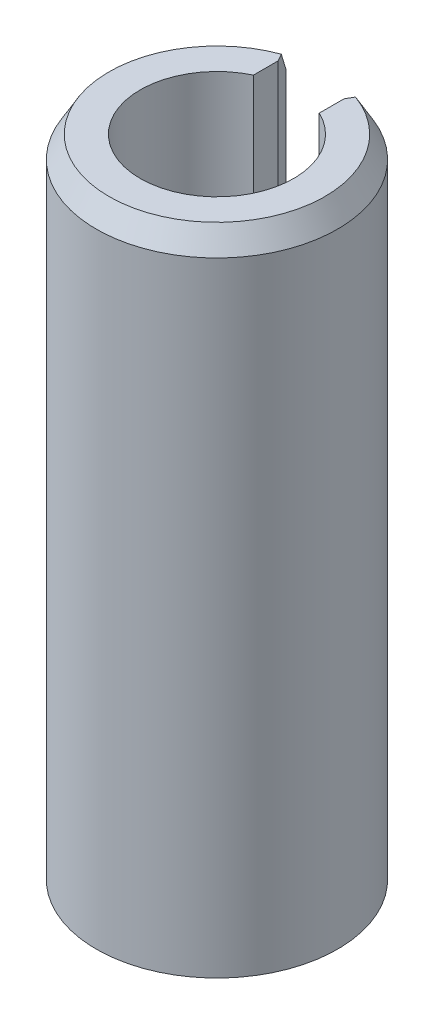
ISO-10303-21;
HEADER;
FILE_DESCRIPTION(('STEP AP214'),'2;1');
FILE_NAME('part.step','',(''),(''),'','','');
FILE_SCHEMA(('AUTOMOTIVE_DESIGN { 1 0 10303 214 1 1 1 1 }'));
ENDSEC;
DATA;
#1=APPLICATION_CONTEXT('core data for automotive mechanical design processes');
#2=APPLICATION_PROTOCOL_DEFINITION('international standard','automotive_design',2000,#1);
#3=PRODUCT_CONTEXT('',#1,'mechanical');
#4=PRODUCT('Part','Part','',(#3));
#5=PRODUCT_RELATED_PRODUCT_CATEGORY('part','',(#4));
#6=PRODUCT_DEFINITION_FORMATION('','',#4);
#7=PRODUCT_DEFINITION_CONTEXT('part definition',#1,'design');
#8=PRODUCT_DEFINITION('design','',#6,#7);
#9=PRODUCT_DEFINITION_SHAPE('','',#8);
#10=(LENGTH_UNIT() NAMED_UNIT(*) SI_UNIT(.MILLI.,.METRE.));
#11=(NAMED_UNIT(*) PLANE_ANGLE_UNIT() SI_UNIT($,.RADIAN.));
#12=(NAMED_UNIT(*) SI_UNIT($,.STERADIAN.) SOLID_ANGLE_UNIT());
#13=UNCERTAINTY_MEASURE_WITH_UNIT(LENGTH_MEASURE(1.E-05),#10,'distance_accuracy_value','');
#14=(GEOMETRIC_REPRESENTATION_CONTEXT(3) GLOBAL_UNCERTAINTY_ASSIGNED_CONTEXT((#13)) GLOBAL_UNIT_ASSIGNED_CONTEXT((#10,
#11,#12)) REPRESENTATION_CONTEXT('',''));
#15=CARTESIAN_POINT('',(0.,0.,0.));
#16=DIRECTION('',(0.,0.,1.));
#17=DIRECTION('',(1.,0.,0.));
#18=AXIS2_PLACEMENT_3D('',#15,#16,#17);
#19=CARTESIAN_POINT('',(0.,15.,0.));
#20=DIRECTION('',(0.,1.,0.));
#21=DIRECTION('',(0.,0.,1.));
#22=AXIS2_PLACEMENT_3D('',#19,#20,#21);
#23=PLANE('',#22);
#24=DIRECTION('',(0.499999999999997,0.,0.86602540378444));
#25=VECTOR('',#24,1.);
#26=CARTESIAN_POINT('',(0.366637572792843,15.,-0.211678301346978));
#27=LINE('',#26,#25);
#28=CARTESIAN_POINT('',(-0.75,15.,-2.14575131106459));
#29=VERTEX_POINT('',#28);
#30=CARTESIAN_POINT('',(-0.845683473796838,15.,-2.3114799491254));
#31=VERTEX_POINT('',#30);
#32=EDGE_CURVE('E140',#29,#31,#27,.F.);
#33=ORIENTED_EDGE('',*,*,#32,.T.);
#34=CARTESIAN_POINT('',(0.,15.,0.));
#35=DIRECTION('',(0.,1.,0.));
#36=DIRECTION('',(0.,0.,1.));
#37=AXIS2_PLACEMENT_3D('',#34,#35,#36);
#38=CIRCLE('',#37,2.46132486540518);
#39=CARTESIAN_POINT('',(0.845683473796839,15.,-2.3114799491254));
#40=VERTEX_POINT('',#39);
#41=EDGE_CURVE('E11',#31,#40,#38,.T.);
#42=ORIENTED_EDGE('',*,*,#41,.T.);
#43=DIRECTION('',(-0.499999999999998,0.,0.86602540378444));
#44=VECTOR('',#43,1.);
#45=CARTESIAN_POINT('',(-0.366637572792845,15.,-0.211678301346979));
#46=LINE('',#45,#44);
#47=CARTESIAN_POINT('',(0.75,15.,-2.14575131106459));
#48=VERTEX_POINT('',#47);
#49=EDGE_CURVE('E121',#40,#48,#46,.T.);
#50=ORIENTED_EDGE('',*,*,#49,.T.);
#51=DIRECTION('',(0.,0.,-1.));
#52=VECTOR('',#51,1.);
#53=CARTESIAN_POINT('',(0.749999999999999,15.,-3.13146030368442));
#54=LINE('',#53,#52);
#55=CARTESIAN_POINT('',(0.75,15.,-1.58113883008419));
#56=VERTEX_POINT('',#55);
#57=EDGE_CURVE('E106',#56,#48,#54,.T.);
#58=ORIENTED_EDGE('',*,*,#57,.F.);
#59=CARTESIAN_POINT('',(0.,15.,0.));
#60=DIRECTION('',(0.,1.,0.));
#61=DIRECTION('',(0.,0.,1.));
#62=AXIS2_PLACEMENT_3D('',#59,#60,#61);
#63=CIRCLE('',#62,1.75);
#64=CARTESIAN_POINT('',(-0.75,15.,-1.58113883008419));
#65=VERTEX_POINT('',#64);
#66=EDGE_CURVE('E115',#65,#56,#63,.T.);
#67=ORIENTED_EDGE('',*,*,#66,.F.);
#68=DIRECTION('',(0.,0.,1.));
#69=VECTOR('',#68,1.);
#70=CARTESIAN_POINT('',(-0.75,15.,-3.13146030368442));
#71=LINE('',#70,#69);
#72=EDGE_CURVE('E123',#29,#65,#71,.T.);
#73=ORIENTED_EDGE('',*,*,#72,.F.);
#74=EDGE_LOOP('',(#33,#42,#50,#58,#67,#73));
#75=FACE_BOUND('',#74,.T.);
#76=ADVANCED_FACE('F33',(#75),#23,.T.);
#77=CARTESIAN_POINT('',(0.,0.,0.));
#78=DIRECTION('',(0.,1.,0.));
#79=DIRECTION('',(0.,0.,1.));
#80=AXIS2_PLACEMENT_3D('',#77,#78,#79);
#81=PLANE('',#80);
#82=DIRECTION('',(0.,0.,-1.));
#83=VECTOR('',#82,1.);
#84=CARTESIAN_POINT('',(0.749999999999999,0.,-3.13146030368442));
#85=LINE('',#84,#83);
#86=CARTESIAN_POINT('',(0.75,0.,-1.58113883008419));
#87=VERTEX_POINT('',#86);
#88=CARTESIAN_POINT('',(0.75,0.,-2.12132034355964));
#89=VERTEX_POINT('',#88);
#90=EDGE_CURVE('E109',#87,#89,#85,.T.);
#91=ORIENTED_EDGE('',*,*,#90,.T.);
#92=CARTESIAN_POINT('',(0.,0.,0.));
#93=DIRECTION('',(0.,1.,0.));
#94=DIRECTION('',(0.,0.,1.));
#95=AXIS2_PLACEMENT_3D('',#92,#93,#94);
#96=CIRCLE('',#95,2.25);
#97=CARTESIAN_POINT('',(-0.75,0.,-2.12132034355964));
#98=VERTEX_POINT('',#97);
#99=EDGE_CURVE('E188',#89,#98,#96,.F.);
#100=ORIENTED_EDGE('',*,*,#99,.T.);
#101=DIRECTION('',(0.,0.,1.));
#102=VECTOR('',#101,1.);
#103=CARTESIAN_POINT('',(-0.75,0.,-3.13146030368442));
#104=LINE('',#103,#102);
#105=CARTESIAN_POINT('',(-0.75,0.,-1.58113883008419));
#106=VERTEX_POINT('',#105);
#107=EDGE_CURVE('E122',#98,#106,#104,.T.);
#108=ORIENTED_EDGE('',*,*,#107,.T.);
#109=CARTESIAN_POINT('',(0.,0.,0.));
#110=DIRECTION('',(0.,1.,0.));
#111=DIRECTION('',(0.,0.,1.));
#112=AXIS2_PLACEMENT_3D('',#109,#110,#111);
#113=CIRCLE('',#112,1.75);
#114=EDGE_CURVE('E128',#106,#87,#113,.T.);
#115=ORIENTED_EDGE('',*,*,#114,.T.);
#116=EDGE_LOOP('',(#91,#100,#108,#115));
#117=FACE_BOUND('',#116,.T.);
#118=ADVANCED_FACE('F203',(#117),#81,.F.);
#119=CARTESIAN_POINT('',(0.,15.,0.));
#120=DIRECTION('',(0.,-1.,0.));
#121=DIRECTION('',(0.,0.,-1.));
#122=AXIS2_PLACEMENT_3D('',#119,#120,#121);
#123=CYLINDRICAL_SURFACE('',#122,2.75);
#124=DIRECTION('',(0.,-1.,0.));
#125=VECTOR('',#124,1.);
#126=CARTESIAN_POINT('',(-0.991971015704534,15.,-2.56485740422389));
#127=LINE('',#126,#125);
#128=CARTESIAN_POINT('',(-0.991971015704534,14.5,-2.56485740422389));
#129=VERTEX_POINT('',#128);
#130=CARTESIAN_POINT('',(-0.991971015704534,0.288675134594811,-2.56485740422389));
#131=VERTEX_POINT('',#130);
#132=EDGE_CURVE('E134',#129,#131,#127,.T.);
#133=ORIENTED_EDGE('',*,*,#132,.T.);
#134=CARTESIAN_POINT('',(0.,0.288675134594811,0.));
#135=DIRECTION('',(0.,1.,0.));
#136=DIRECTION('',(0.,0.,1.));
#137=AXIS2_PLACEMENT_3D('',#134,#135,#136);
#138=CIRCLE('',#137,2.75);
#139=CARTESIAN_POINT('',(0.991971015704535,0.288675134594811,-2.56485740422389));
#140=VERTEX_POINT('',#139);
#141=EDGE_CURVE('E149',#131,#140,#138,.T.);
#142=ORIENTED_EDGE('',*,*,#141,.T.);
#143=DIRECTION('',(0.,-1.,0.));
#144=VECTOR('',#143,1.);
#145=CARTESIAN_POINT('',(0.991971015704535,15.,-2.56485740422389));
#146=LINE('',#145,#144);
#147=CARTESIAN_POINT('',(0.991971015704535,14.5,-2.56485740422389));
#148=VERTEX_POINT('',#147);
#149=EDGE_CURVE('E137',#140,#148,#146,.F.);
#150=ORIENTED_EDGE('',*,*,#149,.T.);
#151=CARTESIAN_POINT('',(0.,14.5,0.));
#152=DIRECTION('',(0.,1.,0.));
#153=DIRECTION('',(0.,0.,1.));
#154=AXIS2_PLACEMENT_3D('',#151,#152,#153);
#155=CIRCLE('',#154,2.75);
#156=EDGE_CURVE('E147',#148,#129,#155,.F.);
#157=ORIENTED_EDGE('',*,*,#156,.T.);
#158=EDGE_LOOP('',(#133,#142,#150,#157));
#159=FACE_BOUND('',#158,.T.);
#160=ADVANCED_FACE('F171',(#159),#123,.T.);
#161=CARTESIAN_POINT('',(0.,15.,0.));
#162=DIRECTION('',(0.,-1.,0.));
#163=DIRECTION('',(0.,0.,-1.));
#164=AXIS2_PLACEMENT_3D('',#161,#162,#163);
#165=CYLINDRICAL_SURFACE('',#164,1.75);
#166=DIRECTION('',(0.,-1.,0.));
#167=VECTOR('',#166,1.);
#168=CARTESIAN_POINT('',(-0.75,15.,-1.58113883008419));
#169=LINE('',#168,#167);
#170=EDGE_CURVE('E114',#65,#106,#169,.T.);
#171=ORIENTED_EDGE('',*,*,#170,.F.);
#172=ORIENTED_EDGE('',*,*,#66,.T.);
#173=DIRECTION('',(0.,-1.,0.));
#174=VECTOR('',#173,1.);
#175=CARTESIAN_POINT('',(0.75,15.,-1.58113883008419));
#176=LINE('',#175,#174);
#177=EDGE_CURVE('E102',#87,#56,#176,.F.);
#178=ORIENTED_EDGE('',*,*,#177,.F.);
#179=ORIENTED_EDGE('',*,*,#114,.F.);
#180=EDGE_LOOP('',(#171,#172,#178,#179));
#181=FACE_BOUND('',#180,.T.);
#182=ADVANCED_FACE('F126',(#181),#165,.F.);
#183=CARTESIAN_POINT('',(0.749999999999999,0.,-3.13146030368442));
#184=DIRECTION('',(1.,0.,0.));
#185=DIRECTION('',(0.,0.,-1.));
#186=AXIS2_PLACEMENT_3D('',#183,#184,#185);
#187=PLANE('',#186);
#188=DIRECTION('',(0.,-1.,0.));
#189=VECTOR('',#188,1.);
#190=CARTESIAN_POINT('',(0.75,0.,-2.14575131106459));
#191=LINE('',#190,#189);
#192=CARTESIAN_POINT('',(0.75,0.0133069567891808,-2.14575131106459));
#193=VERTEX_POINT('',#192);
#194=EDGE_CURVE('E143',#48,#193,#191,.T.);
#195=ORIENTED_EDGE('',*,*,#194,.T.);
#196=CARTESIAN_POINT('',(0.75,0.0133069567891808,-2.14575131106459));
#197=CARTESIAN_POINT('',(0.75,0.0110880535948483,-2.14168006979761));
#198=CARTESIAN_POINT('',(0.75,0.00886968893201585,-2.13760853520556));
#199=CARTESIAN_POINT('',(0.75,0.0044340366689554,-2.12946487937058));
#200=CARTESIAN_POINT('',(0.75,0.00221674906872764,-2.12539275812765));
#201=CARTESIAN_POINT('',(0.75,0.,-2.12132034355964));
#202=B_SPLINE_CURVE_WITH_KNOTS('',3,(#196,#197,#198,#199,#200,#201),.UNSPECIFIED.,.F.,.F.,(4,2,
4),(0.,0.0139099540403344,0.0278199080831488),.UNSPECIFIED.);
#203=EDGE_CURVE('E189',#193,#89,#202,.T.);
#204=ORIENTED_EDGE('',*,*,#203,.T.);
#205=ORIENTED_EDGE('',*,*,#90,.F.);
#206=ORIENTED_EDGE('',*,*,#177,.T.);
#207=ORIENTED_EDGE('',*,*,#57,.T.);
#208=EDGE_LOOP('',(#195,#204,#205,#206,#207));
#209=FACE_BOUND('',#208,.T.);
#210=ADVANCED_FACE('F105',(#209),#187,.F.);
#211=CARTESIAN_POINT('',(-0.75,0.,-3.13146030368442));
#212=DIRECTION('',(-1.,0.,0.));
#213=DIRECTION('',(0.,0.,1.));
#214=AXIS2_PLACEMENT_3D('',#211,#212,#213);
#215=PLANE('',#214);
#216=ORIENTED_EDGE('',*,*,#107,.F.);
#217=CARTESIAN_POINT('',(-0.75,0.,-2.12132034355964));
#218=CARTESIAN_POINT('',(-0.75,0.00221674906872773,-2.12539275812765));
#219=CARTESIAN_POINT('',(-0.75,0.00443403666895556,-2.12946487937058));
#220=CARTESIAN_POINT('',(-0.75,0.00886968893201603,-2.13760853520556));
#221=CARTESIAN_POINT('',(-0.75,0.0110880535948485,-2.14168006979761));
#222=CARTESIAN_POINT('',(-0.75,0.0133069567891809,-2.14575131106459));
#223=B_SPLINE_CURVE_WITH_KNOTS('',3,(#217,#218,#219,#220,#221,#222),.UNSPECIFIED.,.F.,.F.,(4,2,
4),(0.,0.0139099540428145,0.0278199080831492),.UNSPECIFIED.);
#224=CARTESIAN_POINT('',(-0.75,0.013306956789181,-2.14575131106459));
#225=VERTEX_POINT('',#224);
#226=EDGE_CURVE('E57',#98,#225,#223,.T.);
#227=ORIENTED_EDGE('',*,*,#226,.T.);
#228=DIRECTION('',(0.,1.,0.));
#229=VECTOR('',#228,1.);
#230=CARTESIAN_POINT('',(-0.75,0.,-2.14575131106459));
#231=LINE('',#230,#229);
#232=EDGE_CURVE('E145',#225,#29,#231,.T.);
#233=ORIENTED_EDGE('',*,*,#232,.T.);
#234=ORIENTED_EDGE('',*,*,#72,.T.);
#235=ORIENTED_EDGE('',*,*,#170,.T.);
#236=EDGE_LOOP('',(#216,#227,#233,#234,#235));
#237=FACE_BOUND('',#236,.T.);
#238=ADVANCED_FACE('F169',(#237),#215,.F.);
#239=CARTESIAN_POINT('',(0.991971015704535,15.,-2.56485740422389));
#240=DIRECTION('',(-0.86602540378444,0.,-0.499999999999998));
#241=DIRECTION('',(0.,-1.,0.));
#242=AXIS2_PLACEMENT_3D('',#239,#240,#241);
#243=PLANE('',#242);
#244=ORIENTED_EDGE('',*,*,#149,.F.);
#245=CARTESIAN_POINT('',(0.991971015704535,0.288675134594811,-2.56485740422389));
#246=CARTESIAN_POINT('',(0.951670170330039,0.242683233079217,-2.49505429244729));
#247=CARTESIAN_POINT('',(0.911355497029894,0.196739934960585,-2.42522723000089));
#248=CARTESIAN_POINT('',(0.830698491796957,0.104950542352004,-2.2855251989511));
#249=CARTESIAN_POINT('',(0.790356159862256,0.0591044478687595,-2.21565023034439));
#250=CARTESIAN_POINT('',(0.75,0.0133069567891807,-2.14575131106459));
#251=B_SPLINE_CURVE_WITH_KNOTS('',3,(#245,#246,#247,#248,#249,#250),.UNSPECIFIED.,.F.,.F.,(4,2,
4),(0.,0.278400617055466,0.556801253311498),.UNSPECIFIED.);
#252=EDGE_CURVE('E158',#140,#193,#251,.T.);
#253=ORIENTED_EDGE('',*,*,#252,.T.);
#254=ORIENTED_EDGE('',*,*,#194,.F.);
#255=ORIENTED_EDGE('',*,*,#49,.F.);
#256=CARTESIAN_POINT('',(0.845683473796838,15.,-2.3114799491254));
#257=CARTESIAN_POINT('',(0.870092098358385,14.9166986942828,-2.35375692700887));
#258=CARTESIAN_POINT('',(0.894487039204218,14.8333813745084,-2.39601020400149));
#259=CARTESIAN_POINT('',(0.943249553173123,14.6667147078414,-2.48046935570042));
#260=CARTESIAN_POINT('',(0.967617126296522,14.583365360949,-2.5226752304073));
#261=CARTESIAN_POINT('',(0.991971015704535,14.5,-2.56485740422389));
#262=B_SPLINE_CURVE_WITH_KNOTS('',3,(#256,#257,#258,#259,#260,#261),.UNSPECIFIED.,.F.,.F.,(4,2,
4),(0.,0.289655062045835,0.579310120630516),.UNSPECIFIED.);
#263=EDGE_CURVE('E152',#40,#148,#262,.T.);
#264=ORIENTED_EDGE('',*,*,#263,.T.);
#265=EDGE_LOOP('',(#244,#253,#254,#255,#264));
#266=FACE_BOUND('',#265,.T.);
#267=ADVANCED_FACE('F163',(#266),#243,.T.);
#268=CARTESIAN_POINT('',(-0.991971015704534,15.,-2.56485740422389));
#269=DIRECTION('',(-0.86602540378444,0.,0.499999999999997));
#270=DIRECTION('',(0.,-1.,0.));
#271=AXIS2_PLACEMENT_3D('',#268,#269,#270);
#272=PLANE('',#271);
#273=ORIENTED_EDGE('',*,*,#232,.F.);
#274=CARTESIAN_POINT('',(-0.75,0.013306956789181,-2.14575131106459));
#275=CARTESIAN_POINT('',(-0.790356159862256,0.0591044478687596,-2.21565023034439));
#276=CARTESIAN_POINT('',(-0.830698491796956,0.104950542352004,-2.2855251989511));
#277=CARTESIAN_POINT('',(-0.911355497029894,0.196739934960584,-2.42522723000089));
#278=CARTESIAN_POINT('',(-0.951670170330038,0.242683233079217,-2.49505429244729));
#279=CARTESIAN_POINT('',(-0.991971015704534,0.288675134594812,-2.56485740422389));
#280=B_SPLINE_CURVE_WITH_KNOTS('',3,(#274,#275,#276,#277,#278,#279),.UNSPECIFIED.,.F.,.F.,(4,2,
4),(0.,0.278400636256031,0.556801253311498),.UNSPECIFIED.);
#281=EDGE_CURVE('E42',#225,#131,#280,.T.);
#282=ORIENTED_EDGE('',*,*,#281,.T.);
#283=ORIENTED_EDGE('',*,*,#132,.F.);
#284=CARTESIAN_POINT('',(-0.991971015704534,14.5,-2.56485740422389));
#285=CARTESIAN_POINT('',(-0.967617126296521,14.583365360949,-2.5226752304073));
#286=CARTESIAN_POINT('',(-0.943249553173123,14.6667147078414,-2.48046935570042));
#287=CARTESIAN_POINT('',(-0.894487039204218,14.8333813745084,-2.39601020400149));
#288=CARTESIAN_POINT('',(-0.870092098358384,14.9166986942828,-2.35375692700887));
#289=CARTESIAN_POINT('',(-0.845683473796838,15.,-2.3114799491254));
#290=B_SPLINE_CURVE_WITH_KNOTS('',3,(#284,#285,#286,#287,#288,#289),.UNSPECIFIED.,.F.,.F.,(4,2,
4),(0.,0.289655058584681,0.579310120630516),.UNSPECIFIED.);
#291=EDGE_CURVE('E49',#129,#31,#290,.T.);
#292=ORIENTED_EDGE('',*,*,#291,.T.);
#293=ORIENTED_EDGE('',*,*,#32,.F.);
#294=EDGE_LOOP('',(#273,#282,#283,#292,#293));
#295=FACE_BOUND('',#294,.T.);
#296=ADVANCED_FACE('F168',(#295),#272,.F.);
#297=CARTESIAN_POINT('',(0.,0.288675134594811,0.));
#298=DIRECTION('',(0.,1.,0.));
#299=DIRECTION('',(0.,0.,1.));
#300=AXIS2_PLACEMENT_3D('',#297,#298,#299);
#301=CONICAL_SURFACE('',#300,2.75,1.0471975511966);
#302=ORIENTED_EDGE('',*,*,#226,.F.);
#303=ORIENTED_EDGE('',*,*,#99,.F.);
#304=ORIENTED_EDGE('',*,*,#203,.F.);
#305=ORIENTED_EDGE('',*,*,#252,.F.);
#306=ORIENTED_EDGE('',*,*,#141,.F.);
#307=ORIENTED_EDGE('',*,*,#281,.F.);
#308=EDGE_LOOP('',(#302,#303,#304,#305,#306,#307));
#309=FACE_BOUND('',#308,.T.);
#310=ADVANCED_FACE('F176',(#309),#301,.T.);
#311=CARTESIAN_POINT('',(0.,15.,0.));
#312=DIRECTION('',(0.,-1.,0.));
#313=DIRECTION('',(0.,0.,-1.));
#314=AXIS2_PLACEMENT_3D('',#311,#312,#313);
#315=CONICAL_SURFACE('',#314,2.46132486540518,0.523598775598296);
#316=ORIENTED_EDGE('',*,*,#291,.F.);
#317=ORIENTED_EDGE('',*,*,#156,.F.);
#318=ORIENTED_EDGE('',*,*,#263,.F.);
#319=ORIENTED_EDGE('',*,*,#41,.F.);
#320=EDGE_LOOP('',(#316,#317,#318,#319));
#321=FACE_BOUND('',#320,.T.);
#322=ADVANCED_FACE('F35',(#321),#315,.T.);
#323=CLOSED_SHELL('',(#76,#118,#160,#182,#210,#238,#267,#296,#310,#322));
#324=MANIFOLD_SOLID_BREP('B2',#323);
#325=ADVANCED_BREP_SHAPE_REPRESENTATION('',(#18,#324),#14);
#326=SHAPE_DEFINITION_REPRESENTATION(#9,#325);
ENDSEC;
END-ISO-10303-21;
